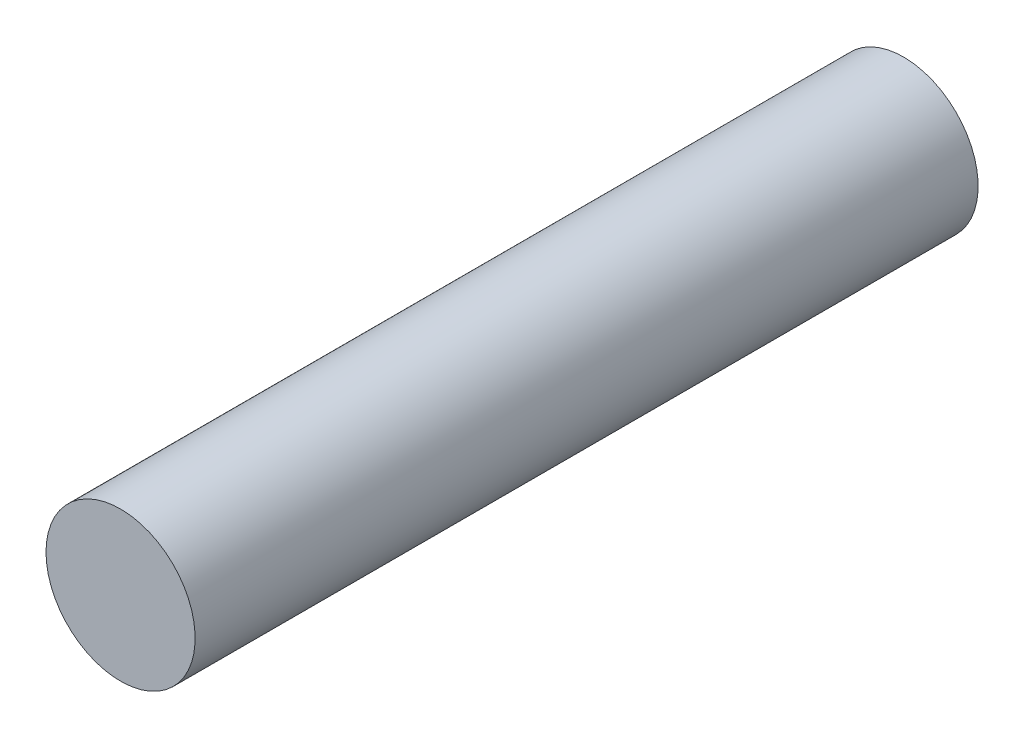
ISO-10303-21;
HEADER;
FILE_DESCRIPTION(('STEP AP214'),'2;1');
FILE_NAME('part.step','',(''),(''),'','','');
FILE_SCHEMA(('AUTOMOTIVE_DESIGN { 1 0 10303 214 1 1 1 1 }'));
ENDSEC;
DATA;
#1=APPLICATION_CONTEXT('core data for automotive mechanical design processes');
#2=APPLICATION_PROTOCOL_DEFINITION('international standard','automotive_design',2000,#1);
#3=PRODUCT_CONTEXT('',#1,'mechanical');
#4=PRODUCT('Part','Part','',(#3));
#5=PRODUCT_RELATED_PRODUCT_CATEGORY('part','',(#4));
#6=PRODUCT_DEFINITION_FORMATION('','',#4);
#7=PRODUCT_DEFINITION_CONTEXT('part definition',#1,'design');
#8=PRODUCT_DEFINITION('design','',#6,#7);
#9=PRODUCT_DEFINITION_SHAPE('','',#8);
#10=(LENGTH_UNIT() NAMED_UNIT(*) SI_UNIT(.MILLI.,.METRE.));
#11=(NAMED_UNIT(*) PLANE_ANGLE_UNIT() SI_UNIT($,.RADIAN.));
#12=(NAMED_UNIT(*) SI_UNIT($,.STERADIAN.) SOLID_ANGLE_UNIT());
#13=UNCERTAINTY_MEASURE_WITH_UNIT(LENGTH_MEASURE(1.E-05),#10,'distance_accuracy_value','');
#14=(GEOMETRIC_REPRESENTATION_CONTEXT(3) GLOBAL_UNCERTAINTY_ASSIGNED_CONTEXT((#13)) GLOBAL_UNIT_ASSIGNED_CONTEXT((#10,
#11,#12)) REPRESENTATION_CONTEXT('',''));
#15=CARTESIAN_POINT('',(0.,0.,0.));
#16=DIRECTION('',(0.,0.,1.));
#17=DIRECTION('',(1.,0.,0.));
#18=AXIS2_PLACEMENT_3D('',#15,#16,#17);
#19=CARTESIAN_POINT('',(0.,0.,21.));
#20=DIRECTION('',(0.,0.,-1.));
#21=DIRECTION('',(-1.,0.,0.));
#22=AXIS2_PLACEMENT_3D('',#19,#20,#21);
#23=CYLINDRICAL_SURFACE('',#22,2.);
#24=CARTESIAN_POINT('',(0.,0.,21.));
#25=DIRECTION('',(0.,0.,1.));
#26=DIRECTION('',(1.,0.,0.));
#27=AXIS2_PLACEMENT_3D('',#24,#25,#26);
#28=CIRCLE('',#27,2.);
#29=CARTESIAN_POINT('',(-2.,0.,21.));
#30=VERTEX_POINT('',#29);
#31=EDGE_CURVE('E10',#30,#30,#28,.T.);
#32=CARTESIAN_POINT('',(0.,0.,0.));
#33=DIRECTION('',(0.,0.,1.));
#34=DIRECTION('',(1.,0.,0.));
#35=AXIS2_PLACEMENT_3D('',#32,#33,#34);
#36=CIRCLE('',#35,2.);
#37=CARTESIAN_POINT('',(-2.,0.,0.));
#38=VERTEX_POINT('',#37);
#39=EDGE_CURVE('E34',#38,#38,#36,.T.);
#40=CARTESIAN_POINT('',(-2.,0.,21.));
#41=CARTESIAN_POINT('',(-2.,0.,20.78125));
#42=CARTESIAN_POINT('',(-2.,0.,20.5625));
#43=CARTESIAN_POINT('',(-2.,0.,20.125));
#44=CARTESIAN_POINT('',(-2.,0.,19.90625));
#45=CARTESIAN_POINT('',(-2.,0.,19.46875));
#46=CARTESIAN_POINT('',(-2.,0.,19.25));
#47=CARTESIAN_POINT('',(-2.,0.,18.8125));
#48=CARTESIAN_POINT('',(-2.,0.,18.59375));
#49=CARTESIAN_POINT('',(-2.,0.,18.15625));
#50=CARTESIAN_POINT('',(-2.,0.,17.9375));
#51=CARTESIAN_POINT('',(-2.,0.,17.5));
#52=CARTESIAN_POINT('',(-2.,0.,17.28125));
#53=CARTESIAN_POINT('',(-2.,0.,16.84375));
#54=CARTESIAN_POINT('',(-2.,0.,16.625));
#55=CARTESIAN_POINT('',(-2.,0.,16.1875));
#56=CARTESIAN_POINT('',(-2.,0.,15.96875));
#57=CARTESIAN_POINT('',(-2.,0.,15.53125));
#58=CARTESIAN_POINT('',(-2.,0.,15.3125));
#59=CARTESIAN_POINT('',(-2.,0.,14.875));
#60=CARTESIAN_POINT('',(-2.,0.,14.65625));
#61=CARTESIAN_POINT('',(-2.,0.,14.21875));
#62=CARTESIAN_POINT('',(-2.,0.,14.));
#63=CARTESIAN_POINT('',(-2.,0.,13.5625));
#64=CARTESIAN_POINT('',(-2.,0.,13.34375));
#65=CARTESIAN_POINT('',(-2.,0.,12.90625));
#66=CARTESIAN_POINT('',(-2.,0.,12.6875));
#67=CARTESIAN_POINT('',(-2.,0.,12.25));
#68=CARTESIAN_POINT('',(-2.,0.,12.03125));
#69=CARTESIAN_POINT('',(-2.,0.,11.59375));
#70=CARTESIAN_POINT('',(-2.,0.,11.375));
#71=CARTESIAN_POINT('',(-2.,0.,10.9375));
#72=CARTESIAN_POINT('',(-2.,0.,10.71875));
#73=CARTESIAN_POINT('',(-2.,0.,10.28125));
#74=CARTESIAN_POINT('',(-2.,0.,10.0625));
#75=CARTESIAN_POINT('',(-2.,0.,9.625));
#76=CARTESIAN_POINT('',(-2.,0.,9.40625));
#77=CARTESIAN_POINT('',(-2.,0.,8.96875));
#78=CARTESIAN_POINT('',(-2.,0.,8.75));
#79=CARTESIAN_POINT('',(-2.,0.,8.3125));
#80=CARTESIAN_POINT('',(-2.,0.,8.09375));
#81=CARTESIAN_POINT('',(-2.,0.,7.65625));
#82=CARTESIAN_POINT('',(-2.,0.,7.4375));
#83=CARTESIAN_POINT('',(-2.,0.,7.));
#84=CARTESIAN_POINT('',(-2.,0.,6.78125));
#85=CARTESIAN_POINT('',(-2.,0.,6.34375));
#86=CARTESIAN_POINT('',(-2.,0.,6.125));
#87=CARTESIAN_POINT('',(-2.,0.,5.6875));
#88=CARTESIAN_POINT('',(-2.,0.,5.46875));
#89=CARTESIAN_POINT('',(-2.,0.,5.03125));
#90=CARTESIAN_POINT('',(-2.,0.,4.8125));
#91=CARTESIAN_POINT('',(-2.,0.,4.375));
#92=CARTESIAN_POINT('',(-2.,0.,4.15625));
#93=CARTESIAN_POINT('',(-2.,0.,3.71875));
#94=CARTESIAN_POINT('',(-2.,0.,3.5));
#95=CARTESIAN_POINT('',(-2.,0.,3.0625));
#96=CARTESIAN_POINT('',(-2.,0.,2.84375));
#97=CARTESIAN_POINT('',(-2.,0.,2.40625));
#98=CARTESIAN_POINT('',(-2.,0.,2.1875));
#99=CARTESIAN_POINT('',(-2.,0.,1.75));
#100=CARTESIAN_POINT('',(-2.,0.,1.53125));
#101=CARTESIAN_POINT('',(-2.,0.,1.09375));
#102=CARTESIAN_POINT('',(-2.,0.,0.875000000000001));
#103=CARTESIAN_POINT('',(-2.,0.,0.4375));
#104=CARTESIAN_POINT('',(-2.,0.,0.21875));
#105=CARTESIAN_POINT('',(-2.,0.,0.));
#106=B_SPLINE_CURVE_WITH_KNOTS('',3,(#40,#41,#42,#43,#44,#45,#46,#47,#48,#49,#50,#51,#52,#53,
#54,#55,#56,#57,#58,#59,#60,#61,#62,#63,#64,#65,#66,#67,#68,#69,#70,#71,#72,#73,#74,#75,#76,#77,
#78,#79,#80,#81,#82,#83,#84,#85,#86,#87,#88,#89,#90,#91,#92,#93,#94,#95,#96,#97,#98,#99,#100,
#101,#102,#103,#104,#105),.UNSPECIFIED.,.F.,.F.,(4,2,2,2,2,2,2,2,2,2,2,2,2,2,2,2,2,2,2,2,2,2,2,
2,2,2,2,2,2,2,2,2,4),(0.,0.656250000000001,1.3125,1.96875,2.625,3.28125,3.9375,4.59375,5.25,
5.90625,6.5625,7.21875,7.875,8.53125,9.1875,9.84375,10.5,11.15625,11.8125,12.46875,13.125,
13.78125,14.4375,15.09375,15.75,16.40625,17.0625,17.71875,18.375,19.03125,19.6875,20.34375,21.),.UNSPECIFIED.);
#107=EDGE_CURVE('BSEAM31',#30,#38,#106,.T.);
#108=ORIENTED_EDGE('',*,*,#31,.F.);
#109=ORIENTED_EDGE('',*,*,#39,.T.);
#110=ORIENTED_EDGE('',*,*,#107,.T.);
#111=ORIENTED_EDGE('',*,*,#107,.F.);
#112=EDGE_LOOP('',(#108,#110,#109,#111));
#113=FACE_BOUND('',#112,.T.);
#114=ADVANCED_FACE('F31',(#113),#23,.T.);
#115=CARTESIAN_POINT('',(0.,0.,21.));
#116=DIRECTION('',(0.,0.,1.));
#117=DIRECTION('',(1.,0.,0.));
#118=AXIS2_PLACEMENT_3D('',#115,#116,#117);
#119=PLANE('',#118);
#120=ORIENTED_EDGE('',*,*,#31,.T.);
#121=EDGE_LOOP('',(#120));
#122=FACE_BOUND('',#121,.T.);
#123=ADVANCED_FACE('F46',(#122),#119,.T.);
#124=CARTESIAN_POINT('',(0.,0.,0.));
#125=DIRECTION('',(0.,0.,1.));
#126=DIRECTION('',(1.,0.,0.));
#127=AXIS2_PLACEMENT_3D('',#124,#125,#126);
#128=PLANE('',#127);
#129=ORIENTED_EDGE('',*,*,#39,.F.);
#130=EDGE_LOOP('',(#129));
#131=FACE_BOUND('',#130,.T.);
#132=ADVANCED_FACE('F44',(#131),#128,.F.);
#133=CLOSED_SHELL('',(#114,#123,#132));
#134=MANIFOLD_SOLID_BREP('B2',#133);
#135=ADVANCED_BREP_SHAPE_REPRESENTATION('',(#18,#134),#14);
#136=SHAPE_DEFINITION_REPRESENTATION(#9,#135);
ENDSEC;
END-ISO-10303-21;
